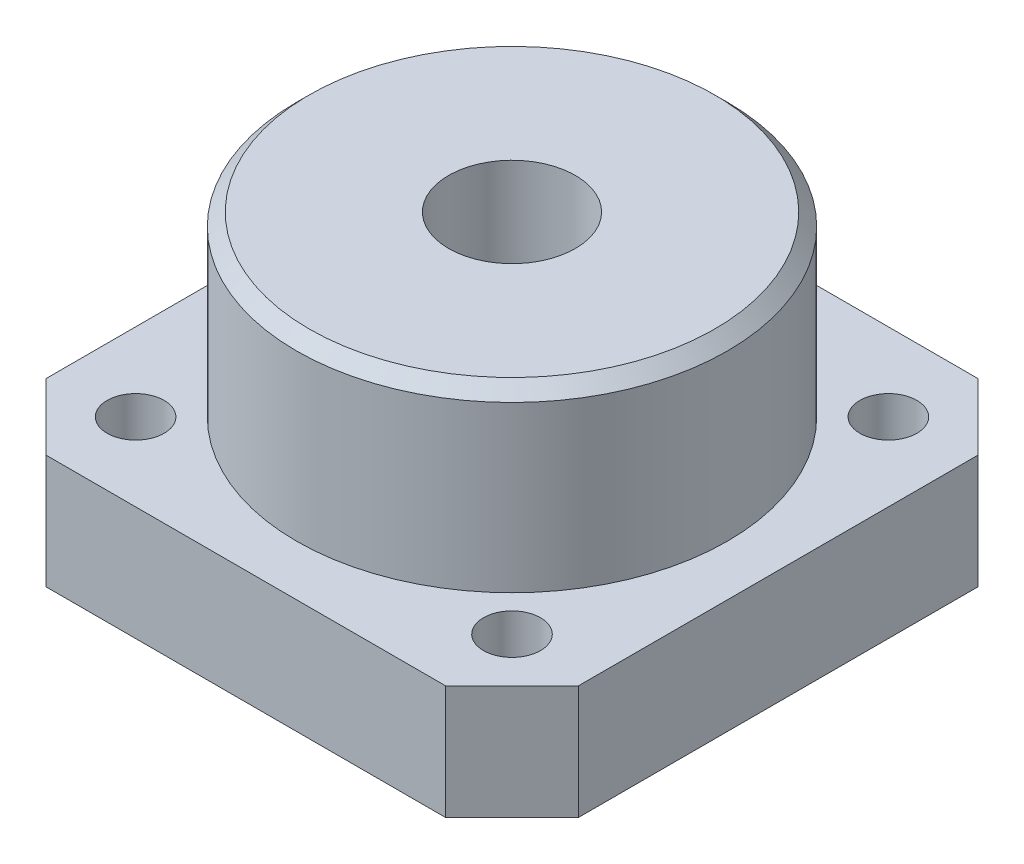
ISO-10303-21;
HEADER;
FILE_DESCRIPTION(('STEP AP214'),'2;1');
FILE_NAME('part.step','',(''),(''),'','','');
FILE_SCHEMA(('AUTOMOTIVE_DESIGN { 1 0 10303 214 1 1 1 1 }'));
ENDSEC;
DATA;
#1=APPLICATION_CONTEXT('core data for automotive mechanical design processes');
#2=APPLICATION_PROTOCOL_DEFINITION('international standard','automotive_design',2000,#1);
#3=PRODUCT_CONTEXT('',#1,'mechanical');
#4=PRODUCT('Part','Part','',(#3));
#5=PRODUCT_RELATED_PRODUCT_CATEGORY('part','',(#4));
#6=PRODUCT_DEFINITION_FORMATION('','',#4);
#7=PRODUCT_DEFINITION_CONTEXT('part definition',#1,'design');
#8=PRODUCT_DEFINITION('design','',#6,#7);
#9=PRODUCT_DEFINITION_SHAPE('','',#8);
#10=(LENGTH_UNIT() NAMED_UNIT(*) SI_UNIT(.MILLI.,.METRE.));
#11=(NAMED_UNIT(*) PLANE_ANGLE_UNIT() SI_UNIT($,.RADIAN.));
#12=(NAMED_UNIT(*) SI_UNIT($,.STERADIAN.) SOLID_ANGLE_UNIT());
#13=UNCERTAINTY_MEASURE_WITH_UNIT(LENGTH_MEASURE(1.E-05),#10,'distance_accuracy_value','');
#14=(GEOMETRIC_REPRESENTATION_CONTEXT(3) GLOBAL_UNCERTAINTY_ASSIGNED_CONTEXT((#13)) GLOBAL_UNIT_ASSIGNED_CONTEXT((#10,
#11,#12)) REPRESENTATION_CONTEXT('',''));
#15=CARTESIAN_POINT('',(0.,0.,0.));
#16=DIRECTION('',(0.,0.,1.));
#17=DIRECTION('',(1.,0.,0.));
#18=AXIS2_PLACEMENT_3D('',#15,#16,#17);
#19=CARTESIAN_POINT('',(0.,9.,0.));
#20=DIRECTION('',(0.,-1.,0.));
#21=DIRECTION('',(0.,0.,-1.));
#22=AXIS2_PLACEMENT_3D('',#19,#20,#21);
#23=PLANE('',#22);
#24=CARTESIAN_POINT('',(0.,9.,0.));
#25=DIRECTION('',(0.,1.,0.));
#26=DIRECTION('',(0.,0.,1.));
#27=AXIS2_PLACEMENT_3D('',#24,#25,#26);
#28=CIRCLE('',#27,17.);
#29=CARTESIAN_POINT('',(0.,9.,17.));
#30=VERTEX_POINT('',#29);
#31=EDGE_CURVE('E169',#30,#30,#28,.T.);
#32=ORIENTED_EDGE('',*,*,#31,.F.);
#33=EDGE_LOOP('',(#32));
#34=FACE_BOUND('',#33,.T.);
#35=DIRECTION('',(-1.,0.,0.));
#36=VECTOR('',#35,1.);
#37=CARTESIAN_POINT('',(-15.7695526217005,9.,-21.));
#38=LINE('',#37,#36);
#39=CARTESIAN_POINT('',(15.7695526217005,9.,-21.));
#40=VERTEX_POINT('',#39);
#41=CARTESIAN_POINT('',(-15.7695526217005,9.,-21.));
#42=VERTEX_POINT('',#41);
#43=EDGE_CURVE('E54',#40,#42,#38,.T.);
#44=ORIENTED_EDGE('',*,*,#43,.T.);
#45=DIRECTION('',(-0.707106781186546,0.,0.707106781186549));
#46=VECTOR('',#45,1.);
#47=CARTESIAN_POINT('',(-21.,9.,-15.7695526217005));
#48=LINE('',#47,#46);
#49=CARTESIAN_POINT('',(-21.,9.,-15.7695526217005));
#50=VERTEX_POINT('',#49);
#51=EDGE_CURVE('E98',#42,#50,#48,.T.);
#52=ORIENTED_EDGE('',*,*,#51,.T.);
#53=DIRECTION('',(0.,0.,1.));
#54=VECTOR('',#53,1.);
#55=CARTESIAN_POINT('',(-21.,9.,0.));
#56=LINE('',#55,#54);
#57=CARTESIAN_POINT('',(-21.,9.,15.7695526217005));
#58=VERTEX_POINT('',#57);
#59=EDGE_CURVE('E253',#50,#58,#56,.T.);
#60=ORIENTED_EDGE('',*,*,#59,.T.);
#61=DIRECTION('',(0.70710678118655,0.,0.707106781186545));
#62=VECTOR('',#61,1.);
#63=CARTESIAN_POINT('',(-15.7695526217005,9.,21.));
#64=LINE('',#63,#62);
#65=CARTESIAN_POINT('',(-15.7695526217005,9.,21.));
#66=VERTEX_POINT('',#65);
#67=EDGE_CURVE('E255',#58,#66,#64,.T.);
#68=ORIENTED_EDGE('',*,*,#67,.T.);
#69=DIRECTION('',(1.,0.,0.));
#70=VECTOR('',#69,1.);
#71=CARTESIAN_POINT('',(0.,9.,21.));
#72=LINE('',#71,#70);
#73=CARTESIAN_POINT('',(15.7695526217005,9.,21.));
#74=VERTEX_POINT('',#73);
#75=EDGE_CURVE('E118',#66,#74,#72,.T.);
#76=ORIENTED_EDGE('',*,*,#75,.T.);
#77=DIRECTION('',(0.707106781186546,0.,-0.707106781186549));
#78=VECTOR('',#77,1.);
#79=CARTESIAN_POINT('',(21.,9.,15.7695526217005));
#80=LINE('',#79,#78);
#81=CARTESIAN_POINT('',(21.,9.,15.7695526217005));
#82=VERTEX_POINT('',#81);
#83=EDGE_CURVE('E112',#74,#82,#80,.T.);
#84=ORIENTED_EDGE('',*,*,#83,.T.);
#85=DIRECTION('',(0.,0.,-1.));
#86=VECTOR('',#85,1.);
#87=CARTESIAN_POINT('',(21.,9.,0.));
#88=LINE('',#87,#86);
#89=CARTESIAN_POINT('',(21.,9.,-15.7695526217005));
#90=VERTEX_POINT('',#89);
#91=EDGE_CURVE('E116',#82,#90,#88,.T.);
#92=ORIENTED_EDGE('',*,*,#91,.T.);
#93=DIRECTION('',(-0.707106781186549,0.,-0.707106781186546));
#94=VECTOR('',#93,1.);
#95=CARTESIAN_POINT('',(15.7695526217005,9.,-21.));
#96=LINE('',#95,#94);
#97=EDGE_CURVE('E133',#90,#40,#96,.T.);
#98=ORIENTED_EDGE('',*,*,#97,.T.);
#99=EDGE_LOOP('',(#44,#52,#60,#68,#76,#84,#92,#98));
#100=FACE_BOUND('',#99,.T.);
#101=CARTESIAN_POINT('',(14.8492424049175,9.,-14.8492424049175));
#102=DIRECTION('',(0.,1.,0.));
#103=DIRECTION('',(0.,0.,1.));
#104=AXIS2_PLACEMENT_3D('',#101,#102,#103);
#105=CIRCLE('',#104,2.25);
#106=CARTESIAN_POINT('',(14.8492424049175,9.,-12.5992424049175));
#107=VERTEX_POINT('',#106);
#108=EDGE_CURVE('E143',#107,#107,#105,.T.);
#109=ORIENTED_EDGE('',*,*,#108,.F.);
#110=EDGE_LOOP('',(#109));
#111=FACE_BOUND('',#110,.T.);
#112=CARTESIAN_POINT('',(14.8492424049175,9.,14.8492424049175));
#113=DIRECTION('',(0.,1.,0.));
#114=DIRECTION('',(0.,0.,1.));
#115=AXIS2_PLACEMENT_3D('',#112,#113,#114);
#116=CIRCLE('',#115,2.25);
#117=CARTESIAN_POINT('',(14.8492424049175,9.,17.0992424049175));
#118=VERTEX_POINT('',#117);
#119=EDGE_CURVE('E263',#118,#118,#116,.T.);
#120=ORIENTED_EDGE('',*,*,#119,.F.);
#121=EDGE_LOOP('',(#120));
#122=FACE_BOUND('',#121,.T.);
#123=CARTESIAN_POINT('',(-14.8492424049175,9.,14.8492424049175));
#124=DIRECTION('',(0.,1.,0.));
#125=DIRECTION('',(0.,0.,1.));
#126=AXIS2_PLACEMENT_3D('',#123,#124,#125);
#127=CIRCLE('',#126,2.25);
#128=CARTESIAN_POINT('',(-14.8492424049175,9.,17.0992424049175));
#129=VERTEX_POINT('',#128);
#130=EDGE_CURVE('E266',#129,#129,#127,.T.);
#131=ORIENTED_EDGE('',*,*,#130,.F.);
#132=EDGE_LOOP('',(#131));
#133=FACE_BOUND('',#132,.T.);
#134=CARTESIAN_POINT('',(-14.8492424049175,9.,-14.8492424049175));
#135=DIRECTION('',(0.,1.,0.));
#136=DIRECTION('',(0.,0.,1.));
#137=AXIS2_PLACEMENT_3D('',#134,#135,#136);
#138=CIRCLE('',#137,2.25);
#139=CARTESIAN_POINT('',(-14.8492424049175,9.,-12.5992424049175));
#140=VERTEX_POINT('',#139);
#141=EDGE_CURVE('E183',#140,#140,#138,.T.);
#142=ORIENTED_EDGE('',*,*,#141,.F.);
#143=EDGE_LOOP('',(#142));
#144=FACE_BOUND('',#143,.T.);
#145=ADVANCED_FACE('F37',(#34,#100,#111,#122,#133,#144),#23,.F.);
#146=CARTESIAN_POINT('',(0.,0.,0.));
#147=DIRECTION('',(0.,-1.,0.));
#148=DIRECTION('',(0.,0.,-1.));
#149=AXIS2_PLACEMENT_3D('',#146,#147,#148);
#150=PLANE('',#149);
#151=CARTESIAN_POINT('',(0.,0.,0.));
#152=DIRECTION('',(0.,-1.,0.));
#153=DIRECTION('',(0.,0.,-1.));
#154=AXIS2_PLACEMENT_3D('',#151,#152,#153);
#155=CIRCLE('',#154,13.);
#156=CARTESIAN_POINT('',(0.,0.,-13.));
#157=VERTEX_POINT('',#156);
#158=EDGE_CURVE('E281',#157,#157,#155,.T.);
#159=ORIENTED_EDGE('',*,*,#158,.F.);
#160=EDGE_LOOP('',(#159));
#161=FACE_BOUND('',#160,.T.);
#162=CARTESIAN_POINT('',(-14.8492424049175,0.,14.8492424049175));
#163=DIRECTION('',(0.,1.,0.));
#164=DIRECTION('',(0.,0.,1.));
#165=AXIS2_PLACEMENT_3D('',#162,#163,#164);
#166=CIRCLE('',#165,4.);
#167=CARTESIAN_POINT('',(-14.8492424049175,0.,18.8492424049175));
#168=VERTEX_POINT('',#167);
#169=EDGE_CURVE('E277',#168,#168,#166,.T.);
#170=ORIENTED_EDGE('',*,*,#169,.T.);
#171=EDGE_LOOP('',(#170));
#172=FACE_BOUND('',#171,.T.);
#173=CARTESIAN_POINT('',(14.8492424049175,0.,14.8492424049175));
#174=DIRECTION('',(0.,1.,0.));
#175=DIRECTION('',(0.,0.,1.));
#176=AXIS2_PLACEMENT_3D('',#173,#174,#175);
#177=CIRCLE('',#176,4.);
#178=CARTESIAN_POINT('',(14.8492424049175,0.,18.8492424049175));
#179=VERTEX_POINT('',#178);
#180=EDGE_CURVE('E284',#179,#179,#177,.T.);
#181=ORIENTED_EDGE('',*,*,#180,.T.);
#182=EDGE_LOOP('',(#181));
#183=FACE_BOUND('',#182,.T.);
#184=CARTESIAN_POINT('',(14.8492424049175,0.,-14.8492424049175));
#185=DIRECTION('',(0.,1.,0.));
#186=DIRECTION('',(0.,0.,1.));
#187=AXIS2_PLACEMENT_3D('',#184,#185,#186);
#188=CIRCLE('',#187,4.);
#189=CARTESIAN_POINT('',(14.8492424049175,0.,-10.8492424049175));
#190=VERTEX_POINT('',#189);
#191=EDGE_CURVE('E290',#190,#190,#188,.T.);
#192=ORIENTED_EDGE('',*,*,#191,.T.);
#193=EDGE_LOOP('',(#192));
#194=FACE_BOUND('',#193,.T.);
#195=CARTESIAN_POINT('',(-14.8492424049175,0.,-14.8492424049175));
#196=DIRECTION('',(0.,1.,0.));
#197=DIRECTION('',(0.,0.,1.));
#198=AXIS2_PLACEMENT_3D('',#195,#196,#197);
#199=CIRCLE('',#198,4.);
#200=CARTESIAN_POINT('',(-14.8492424049175,0.,-10.8492424049175));
#201=VERTEX_POINT('',#200);
#202=EDGE_CURVE('E271',#201,#201,#199,.T.);
#203=ORIENTED_EDGE('',*,*,#202,.T.);
#204=EDGE_LOOP('',(#203));
#205=FACE_BOUND('',#204,.T.);
#206=DIRECTION('',(-0.707106781186546,0.,0.707106781186549));
#207=VECTOR('',#206,1.);
#208=CARTESIAN_POINT('',(-21.,0.,-15.7695526217005));
#209=LINE('',#208,#207);
#210=CARTESIAN_POINT('',(-15.7695526217005,0.,-21.));
#211=VERTEX_POINT('',#210);
#212=CARTESIAN_POINT('',(-21.,0.,-15.7695526217005));
#213=VERTEX_POINT('',#212);
#214=EDGE_CURVE('E139',#211,#213,#209,.T.);
#215=ORIENTED_EDGE('',*,*,#214,.F.);
#216=DIRECTION('',(-1.,0.,0.));
#217=VECTOR('',#216,1.);
#218=CARTESIAN_POINT('',(0.,0.,-21.));
#219=LINE('',#218,#217);
#220=CARTESIAN_POINT('',(15.7695526217005,0.,-21.));
#221=VERTEX_POINT('',#220);
#222=EDGE_CURVE('E153',#221,#211,#219,.T.);
#223=ORIENTED_EDGE('',*,*,#222,.F.);
#224=DIRECTION('',(-0.707106781186549,0.,-0.707106781186546));
#225=VECTOR('',#224,1.);
#226=CARTESIAN_POINT('',(15.7695526217005,0.,-21.));
#227=LINE('',#226,#225);
#228=CARTESIAN_POINT('',(21.,0.,-15.7695526217005));
#229=VERTEX_POINT('',#228);
#230=EDGE_CURVE('E90',#229,#221,#227,.T.);
#231=ORIENTED_EDGE('',*,*,#230,.F.);
#232=DIRECTION('',(0.,0.,-1.));
#233=VECTOR('',#232,1.);
#234=CARTESIAN_POINT('',(21.,0.,-15.7695526217005));
#235=LINE('',#234,#233);
#236=CARTESIAN_POINT('',(21.,0.,15.7695526217005));
#237=VERTEX_POINT('',#236);
#238=EDGE_CURVE('E83',#237,#229,#235,.T.);
#239=ORIENTED_EDGE('',*,*,#238,.F.);
#240=DIRECTION('',(0.707106781186546,0.,-0.707106781186549));
#241=VECTOR('',#240,1.);
#242=CARTESIAN_POINT('',(21.,0.,15.7695526217005));
#243=LINE('',#242,#241);
#244=CARTESIAN_POINT('',(15.7695526217005,0.,21.));
#245=VERTEX_POINT('',#244);
#246=EDGE_CURVE('E127',#245,#237,#243,.T.);
#247=ORIENTED_EDGE('',*,*,#246,.F.);
#248=DIRECTION('',(1.,0.,0.));
#249=VECTOR('',#248,1.);
#250=CARTESIAN_POINT('',(15.7695526217005,0.,21.));
#251=LINE('',#250,#249);
#252=CARTESIAN_POINT('',(-15.7695526217005,0.,21.));
#253=VERTEX_POINT('',#252);
#254=EDGE_CURVE('E148',#253,#245,#251,.T.);
#255=ORIENTED_EDGE('',*,*,#254,.F.);
#256=DIRECTION('',(0.70710678118655,0.,0.707106781186545));
#257=VECTOR('',#256,1.);
#258=CARTESIAN_POINT('',(-15.7695526217005,0.,21.));
#259=LINE('',#258,#257);
#260=CARTESIAN_POINT('',(-21.,0.,15.7695526217005));
#261=VERTEX_POINT('',#260);
#262=EDGE_CURVE('E145',#261,#253,#259,.T.);
#263=ORIENTED_EDGE('',*,*,#262,.F.);
#264=DIRECTION('',(0.,0.,1.));
#265=VECTOR('',#264,1.);
#266=CARTESIAN_POINT('',(-21.,0.,15.7695526217005));
#267=LINE('',#266,#265);
#268=EDGE_CURVE('E142',#213,#261,#267,.T.);
#269=ORIENTED_EDGE('',*,*,#268,.F.);
#270=EDGE_LOOP('',(#215,#223,#231,#239,#247,#255,#263,#269));
#271=FACE_BOUND('',#270,.T.);
#272=ADVANCED_FACE('F208',(#161,#172,#183,#194,#205,#271),#150,.T.);
#273=CARTESIAN_POINT('',(-21.,9.,-15.7695526217005));
#274=DIRECTION('',(0.707106781186549,0.,0.707106781186546));
#275=DIRECTION('',(0.707106781186546,0.,-0.707106781186549));
#276=AXIS2_PLACEMENT_3D('',#273,#274,#275);
#277=PLANE('',#276);
#278=ORIENTED_EDGE('',*,*,#214,.T.);
#279=DIRECTION('',(0.,-1.,0.));
#280=VECTOR('',#279,1.);
#281=CARTESIAN_POINT('',(-21.,9.,-15.7695526217005));
#282=LINE('',#281,#280);
#283=EDGE_CURVE('E164',#50,#213,#282,.T.);
#284=ORIENTED_EDGE('',*,*,#283,.F.);
#285=ORIENTED_EDGE('',*,*,#51,.F.);
#286=DIRECTION('',(0.,-1.,0.));
#287=VECTOR('',#286,1.);
#288=CARTESIAN_POINT('',(-15.7695526217005,9.,-21.));
#289=LINE('',#288,#287);
#290=EDGE_CURVE('E167',#42,#211,#289,.T.);
#291=ORIENTED_EDGE('',*,*,#290,.T.);
#292=EDGE_LOOP('',(#278,#284,#285,#291));
#293=FACE_BOUND('',#292,.T.);
#294=ADVANCED_FACE('F214',(#293),#277,.F.);
#295=CARTESIAN_POINT('',(-21.,9.,15.7695526217005));
#296=DIRECTION('',(1.,0.,0.));
#297=DIRECTION('',(0.,0.,-1.));
#298=AXIS2_PLACEMENT_3D('',#295,#296,#297);
#299=PLANE('',#298);
#300=ORIENTED_EDGE('',*,*,#268,.T.);
#301=DIRECTION('',(0.,-1.,0.));
#302=VECTOR('',#301,1.);
#303=CARTESIAN_POINT('',(-21.,9.,15.7695526217005));
#304=LINE('',#303,#302);
#305=EDGE_CURVE('E161',#58,#261,#304,.T.);
#306=ORIENTED_EDGE('',*,*,#305,.F.);
#307=ORIENTED_EDGE('',*,*,#59,.F.);
#308=ORIENTED_EDGE('',*,*,#283,.T.);
#309=EDGE_LOOP('',(#300,#306,#307,#308));
#310=FACE_BOUND('',#309,.T.);
#311=ADVANCED_FACE('F240',(#310),#299,.F.);
#312=CARTESIAN_POINT('',(-15.7695526217005,9.,21.));
#313=DIRECTION('',(0.707106781186545,0.,-0.70710678118655));
#314=DIRECTION('',(-0.70710678118655,0.,-0.707106781186545));
#315=AXIS2_PLACEMENT_3D('',#312,#313,#314);
#316=PLANE('',#315);
#317=ORIENTED_EDGE('',*,*,#262,.T.);
#318=DIRECTION('',(0.,-1.,0.));
#319=VECTOR('',#318,1.);
#320=CARTESIAN_POINT('',(-15.7695526217005,9.,21.));
#321=LINE('',#320,#319);
#322=EDGE_CURVE('E158',#66,#253,#321,.T.);
#323=ORIENTED_EDGE('',*,*,#322,.F.);
#324=ORIENTED_EDGE('',*,*,#67,.F.);
#325=ORIENTED_EDGE('',*,*,#305,.T.);
#326=EDGE_LOOP('',(#317,#323,#324,#325));
#327=FACE_BOUND('',#326,.T.);
#328=ADVANCED_FACE('F236',(#327),#316,.F.);
#329=CARTESIAN_POINT('',(15.7695526217005,9.,21.));
#330=DIRECTION('',(0.,0.,-1.));
#331=DIRECTION('',(-1.,0.,0.));
#332=AXIS2_PLACEMENT_3D('',#329,#330,#331);
#333=PLANE('',#332);
#334=ORIENTED_EDGE('',*,*,#254,.T.);
#335=DIRECTION('',(0.,-1.,0.));
#336=VECTOR('',#335,1.);
#337=CARTESIAN_POINT('',(15.7695526217005,9.,21.));
#338=LINE('',#337,#336);
#339=EDGE_CURVE('E128',#74,#245,#338,.T.);
#340=ORIENTED_EDGE('',*,*,#339,.F.);
#341=ORIENTED_EDGE('',*,*,#75,.F.);
#342=ORIENTED_EDGE('',*,*,#322,.T.);
#343=EDGE_LOOP('',(#334,#340,#341,#342));
#344=FACE_BOUND('',#343,.T.);
#345=ADVANCED_FACE('F233',(#344),#333,.F.);
#346=CARTESIAN_POINT('',(21.,9.,15.7695526217005));
#347=DIRECTION('',(-0.707106781186549,0.,-0.707106781186546));
#348=DIRECTION('',(-0.707106781186546,0.,0.707106781186549));
#349=AXIS2_PLACEMENT_3D('',#346,#347,#348);
#350=PLANE('',#349);
#351=ORIENTED_EDGE('',*,*,#246,.T.);
#352=DIRECTION('',(0.,-1.,0.));
#353=VECTOR('',#352,1.);
#354=CARTESIAN_POINT('',(21.,9.,15.7695526217005));
#355=LINE('',#354,#353);
#356=EDGE_CURVE('E124',#82,#237,#355,.T.);
#357=ORIENTED_EDGE('',*,*,#356,.F.);
#358=ORIENTED_EDGE('',*,*,#83,.F.);
#359=ORIENTED_EDGE('',*,*,#339,.T.);
#360=EDGE_LOOP('',(#351,#357,#358,#359));
#361=FACE_BOUND('',#360,.T.);
#362=ADVANCED_FACE('F125',(#361),#350,.F.);
#363=CARTESIAN_POINT('',(21.,9.,-15.7695526217005));
#364=DIRECTION('',(-1.,0.,0.));
#365=DIRECTION('',(0.,0.,1.));
#366=AXIS2_PLACEMENT_3D('',#363,#364,#365);
#367=PLANE('',#366);
#368=ORIENTED_EDGE('',*,*,#238,.T.);
#369=DIRECTION('',(0.,-1.,0.));
#370=VECTOR('',#369,1.);
#371=CARTESIAN_POINT('',(21.,9.,-15.7695526217005));
#372=LINE('',#371,#370);
#373=EDGE_CURVE('E129',#90,#229,#372,.T.);
#374=ORIENTED_EDGE('',*,*,#373,.F.);
#375=ORIENTED_EDGE('',*,*,#91,.F.);
#376=ORIENTED_EDGE('',*,*,#356,.T.);
#377=EDGE_LOOP('',(#368,#374,#375,#376));
#378=FACE_BOUND('',#377,.T.);
#379=ADVANCED_FACE('F131',(#378),#367,.F.);
#380=CARTESIAN_POINT('',(15.7695526217005,9.,-21.));
#381=DIRECTION('',(-0.707106781186546,0.,0.707106781186549));
#382=DIRECTION('',(0.707106781186549,0.,0.707106781186546));
#383=AXIS2_PLACEMENT_3D('',#380,#381,#382);
#384=PLANE('',#383);
#385=ORIENTED_EDGE('',*,*,#230,.T.);
#386=DIRECTION('',(0.,-1.,0.));
#387=VECTOR('',#386,1.);
#388=CARTESIAN_POINT('',(15.7695526217005,9.,-21.));
#389=LINE('',#388,#387);
#390=EDGE_CURVE('E135',#40,#221,#389,.T.);
#391=ORIENTED_EDGE('',*,*,#390,.F.);
#392=ORIENTED_EDGE('',*,*,#97,.F.);
#393=ORIENTED_EDGE('',*,*,#373,.T.);
#394=EDGE_LOOP('',(#385,#391,#392,#393));
#395=FACE_BOUND('',#394,.T.);
#396=ADVANCED_FACE('F226',(#395),#384,.F.);
#397=CARTESIAN_POINT('',(0.,9.,-21.));
#398=DIRECTION('',(0.,0.,1.));
#399=DIRECTION('',(1.,0.,0.));
#400=AXIS2_PLACEMENT_3D('',#397,#398,#399);
#401=PLANE('',#400);
#402=ORIENTED_EDGE('',*,*,#222,.T.);
#403=ORIENTED_EDGE('',*,*,#290,.F.);
#404=ORIENTED_EDGE('',*,*,#43,.F.);
#405=ORIENTED_EDGE('',*,*,#390,.T.);
#406=EDGE_LOOP('',(#402,#403,#404,#405));
#407=FACE_BOUND('',#406,.T.);
#408=ADVANCED_FACE('F223',(#407),#401,.F.);
#409=CARTESIAN_POINT('',(14.8492424049175,9.,-14.8492424049175));
#410=DIRECTION('',(0.,-1.,0.));
#411=DIRECTION('',(0.,0.,-1.));
#412=AXIS2_PLACEMENT_3D('',#409,#410,#411);
#413=CYLINDRICAL_SURFACE('',#412,2.25);
#414=CARTESIAN_POINT('',(14.8492424049175,4.,-14.8492424049175));
#415=DIRECTION('',(0.,1.,0.));
#416=DIRECTION('',(0.,0.,1.));
#417=AXIS2_PLACEMENT_3D('',#414,#415,#416);
#418=CIRCLE('',#417,2.25);
#419=CARTESIAN_POINT('',(14.8492424049175,4.,-12.5992424049175));
#420=VERTEX_POINT('',#419);
#421=EDGE_CURVE('E180',#420,#420,#418,.T.);
#422=ORIENTED_EDGE('',*,*,#421,.F.);
#423=EDGE_LOOP('',(#422));
#424=FACE_BOUND('',#423,.T.);
#425=ORIENTED_EDGE('',*,*,#108,.T.);
#426=EDGE_LOOP('',(#425));
#427=FACE_BOUND('',#426,.T.);
#428=ADVANCED_FACE('F220',(#424,#427),#413,.F.);
#429=CARTESIAN_POINT('',(14.8492424049175,9.,14.8492424049175));
#430=DIRECTION('',(0.,-1.,0.));
#431=DIRECTION('',(0.,0.,-1.));
#432=AXIS2_PLACEMENT_3D('',#429,#430,#431);
#433=CYLINDRICAL_SURFACE('',#432,2.25);
#434=CARTESIAN_POINT('',(14.8492424049175,4.,14.8492424049175));
#435=DIRECTION('',(0.,1.,0.));
#436=DIRECTION('',(0.,0.,1.));
#437=AXIS2_PLACEMENT_3D('',#434,#435,#436);
#438=CIRCLE('',#437,2.25);
#439=CARTESIAN_POINT('',(14.8492424049175,4.,17.0992424049175));
#440=VERTEX_POINT('',#439);
#441=EDGE_CURVE('E177',#440,#440,#438,.T.);
#442=ORIENTED_EDGE('',*,*,#441,.F.);
#443=EDGE_LOOP('',(#442));
#444=FACE_BOUND('',#443,.T.);
#445=ORIENTED_EDGE('',*,*,#119,.T.);
#446=EDGE_LOOP('',(#445));
#447=FACE_BOUND('',#446,.T.);
#448=ADVANCED_FACE('F362',(#444,#447),#433,.F.);
#449=CARTESIAN_POINT('',(-14.8492424049175,9.,14.8492424049175));
#450=DIRECTION('',(0.,-1.,0.));
#451=DIRECTION('',(0.,0.,-1.));
#452=AXIS2_PLACEMENT_3D('',#449,#450,#451);
#453=CYLINDRICAL_SURFACE('',#452,2.25);
#454=CARTESIAN_POINT('',(-14.8492424049175,4.,14.8492424049175));
#455=DIRECTION('',(0.,1.,0.));
#456=DIRECTION('',(0.,0.,1.));
#457=AXIS2_PLACEMENT_3D('',#454,#455,#456);
#458=CIRCLE('',#457,2.25);
#459=CARTESIAN_POINT('',(-14.8492424049175,4.,17.0992424049175));
#460=VERTEX_POINT('',#459);
#461=EDGE_CURVE('E173',#460,#460,#458,.T.);
#462=ORIENTED_EDGE('',*,*,#461,.F.);
#463=EDGE_LOOP('',(#462));
#464=FACE_BOUND('',#463,.T.);
#465=ORIENTED_EDGE('',*,*,#130,.T.);
#466=EDGE_LOOP('',(#465));
#467=FACE_BOUND('',#466,.T.);
#468=ADVANCED_FACE('F359',(#464,#467),#453,.F.);
#469=CARTESIAN_POINT('',(-14.8492424049175,9.,-14.8492424049175));
#470=DIRECTION('',(0.,-1.,0.));
#471=DIRECTION('',(0.,0.,-1.));
#472=AXIS2_PLACEMENT_3D('',#469,#470,#471);
#473=CYLINDRICAL_SURFACE('',#472,2.25);
#474=CARTESIAN_POINT('',(-14.8492424049175,4.,-14.8492424049175));
#475=DIRECTION('',(0.,1.,0.));
#476=DIRECTION('',(0.,0.,1.));
#477=AXIS2_PLACEMENT_3D('',#474,#475,#476);
#478=CIRCLE('',#477,2.25);
#479=CARTESIAN_POINT('',(-14.8492424049175,4.,-12.5992424049175));
#480=VERTEX_POINT('',#479);
#481=EDGE_CURVE('E170',#480,#480,#478,.T.);
#482=ORIENTED_EDGE('',*,*,#481,.F.);
#483=EDGE_LOOP('',(#482));
#484=FACE_BOUND('',#483,.T.);
#485=ORIENTED_EDGE('',*,*,#141,.T.);
#486=EDGE_LOOP('',(#485));
#487=FACE_BOUND('',#486,.T.);
#488=ADVANCED_FACE('F355',(#484,#487),#473,.F.);
#489=CARTESIAN_POINT('',(-14.8492424049175,4.,-14.8492424049175));
#490=DIRECTION('',(0.,-1.,0.));
#491=DIRECTION('',(0.,0.,-1.));
#492=AXIS2_PLACEMENT_3D('',#489,#490,#491);
#493=CYLINDRICAL_SURFACE('',#492,4.);
#494=CARTESIAN_POINT('',(-14.8492424049175,4.,-14.8492424049175));
#495=DIRECTION('',(0.,1.,0.));
#496=DIRECTION('',(0.,0.,1.));
#497=AXIS2_PLACEMENT_3D('',#494,#495,#496);
#498=CIRCLE('',#497,4.);
#499=CARTESIAN_POINT('',(-14.8492424049175,4.,-10.8492424049175));
#500=VERTEX_POINT('',#499);
#501=EDGE_CURVE('E174',#500,#500,#498,.T.);
#502=ORIENTED_EDGE('',*,*,#501,.T.);
#503=EDGE_LOOP('',(#502));
#504=FACE_BOUND('',#503,.T.);
#505=ORIENTED_EDGE('',*,*,#202,.F.);
#506=EDGE_LOOP('',(#505));
#507=FACE_BOUND('',#506,.T.);
#508=ADVANCED_FACE('F351',(#504,#507),#493,.F.);
#509=CARTESIAN_POINT('',(-14.8492424049175,4.,-14.8492424049175));
#510=DIRECTION('',(0.,1.,0.));
#511=DIRECTION('',(0.,0.,1.));
#512=AXIS2_PLACEMENT_3D('',#509,#510,#511);
#513=PLANE('',#512);
#514=ORIENTED_EDGE('',*,*,#481,.T.);
#515=EDGE_LOOP('',(#514));
#516=FACE_BOUND('',#515,.T.);
#517=ORIENTED_EDGE('',*,*,#501,.F.);
#518=EDGE_LOOP('',(#517));
#519=FACE_BOUND('',#518,.T.);
#520=ADVANCED_FACE('F347',(#516,#519),#513,.F.);
#521=CARTESIAN_POINT('',(-14.8492424049175,4.,14.8492424049175));
#522=DIRECTION('',(0.,-1.,0.));
#523=DIRECTION('',(0.,0.,-1.));
#524=AXIS2_PLACEMENT_3D('',#521,#522,#523);
#525=CYLINDRICAL_SURFACE('',#524,4.);
#526=CARTESIAN_POINT('',(-14.8492424049175,4.,14.8492424049175));
#527=DIRECTION('',(0.,1.,0.));
#528=DIRECTION('',(0.,0.,1.));
#529=AXIS2_PLACEMENT_3D('',#526,#527,#528);
#530=CIRCLE('',#529,4.);
#531=CARTESIAN_POINT('',(-14.8492424049175,4.,18.8492424049175));
#532=VERTEX_POINT('',#531);
#533=EDGE_CURVE('E280',#532,#532,#530,.T.);
#534=ORIENTED_EDGE('',*,*,#533,.T.);
#535=EDGE_LOOP('',(#534));
#536=FACE_BOUND('',#535,.T.);
#537=ORIENTED_EDGE('',*,*,#169,.F.);
#538=EDGE_LOOP('',(#537));
#539=FACE_BOUND('',#538,.T.);
#540=ADVANCED_FACE('F343',(#536,#539),#525,.F.);
#541=CARTESIAN_POINT('',(-14.8492424049175,4.,14.8492424049175));
#542=DIRECTION('',(0.,1.,0.));
#543=DIRECTION('',(0.,0.,1.));
#544=AXIS2_PLACEMENT_3D('',#541,#542,#543);
#545=PLANE('',#544);
#546=ORIENTED_EDGE('',*,*,#461,.T.);
#547=EDGE_LOOP('',(#546));
#548=FACE_BOUND('',#547,.T.);
#549=ORIENTED_EDGE('',*,*,#533,.F.);
#550=EDGE_LOOP('',(#549));
#551=FACE_BOUND('',#550,.T.);
#552=ADVANCED_FACE('F339',(#548,#551),#545,.F.);
#553=CARTESIAN_POINT('',(14.8492424049175,4.,14.8492424049175));
#554=DIRECTION('',(0.,-1.,0.));
#555=DIRECTION('',(0.,0.,-1.));
#556=AXIS2_PLACEMENT_3D('',#553,#554,#555);
#557=CYLINDRICAL_SURFACE('',#556,4.);
#558=CARTESIAN_POINT('',(14.8492424049175,4.,14.8492424049175));
#559=DIRECTION('',(0.,1.,0.));
#560=DIRECTION('',(0.,0.,1.));
#561=AXIS2_PLACEMENT_3D('',#558,#559,#560);
#562=CIRCLE('',#561,4.);
#563=CARTESIAN_POINT('',(14.8492424049175,4.,18.8492424049175));
#564=VERTEX_POINT('',#563);
#565=EDGE_CURVE('E287',#564,#564,#562,.T.);
#566=ORIENTED_EDGE('',*,*,#565,.T.);
#567=EDGE_LOOP('',(#566));
#568=FACE_BOUND('',#567,.T.);
#569=ORIENTED_EDGE('',*,*,#180,.F.);
#570=EDGE_LOOP('',(#569));
#571=FACE_BOUND('',#570,.T.);
#572=ADVANCED_FACE('F335',(#568,#571),#557,.F.);
#573=CARTESIAN_POINT('',(14.8492424049175,4.,14.8492424049175));
#574=DIRECTION('',(0.,1.,0.));
#575=DIRECTION('',(0.,0.,1.));
#576=AXIS2_PLACEMENT_3D('',#573,#574,#575);
#577=PLANE('',#576);
#578=ORIENTED_EDGE('',*,*,#441,.T.);
#579=EDGE_LOOP('',(#578));
#580=FACE_BOUND('',#579,.T.);
#581=ORIENTED_EDGE('',*,*,#565,.F.);
#582=EDGE_LOOP('',(#581));
#583=FACE_BOUND('',#582,.T.);
#584=ADVANCED_FACE('F331',(#580,#583),#577,.F.);
#585=CARTESIAN_POINT('',(14.8492424049175,4.,-14.8492424049175));
#586=DIRECTION('',(0.,-1.,0.));
#587=DIRECTION('',(0.,0.,-1.));
#588=AXIS2_PLACEMENT_3D('',#585,#586,#587);
#589=CYLINDRICAL_SURFACE('',#588,4.);
#590=CARTESIAN_POINT('',(14.8492424049175,4.,-14.8492424049175));
#591=DIRECTION('',(0.,1.,0.));
#592=DIRECTION('',(0.,0.,1.));
#593=AXIS2_PLACEMENT_3D('',#590,#591,#592);
#594=CIRCLE('',#593,4.);
#595=CARTESIAN_POINT('',(14.8492424049175,4.,-10.8492424049175));
#596=VERTEX_POINT('',#595);
#597=EDGE_CURVE('E274',#596,#596,#594,.T.);
#598=ORIENTED_EDGE('',*,*,#597,.T.);
#599=EDGE_LOOP('',(#598));
#600=FACE_BOUND('',#599,.T.);
#601=ORIENTED_EDGE('',*,*,#191,.F.);
#602=EDGE_LOOP('',(#601));
#603=FACE_BOUND('',#602,.T.);
#604=ADVANCED_FACE('F327',(#600,#603),#589,.F.);
#605=CARTESIAN_POINT('',(14.8492424049175,4.,-14.8492424049175));
#606=DIRECTION('',(0.,1.,0.));
#607=DIRECTION('',(0.,0.,1.));
#608=AXIS2_PLACEMENT_3D('',#605,#606,#607);
#609=PLANE('',#608);
#610=ORIENTED_EDGE('',*,*,#421,.T.);
#611=EDGE_LOOP('',(#610));
#612=FACE_BOUND('',#611,.T.);
#613=ORIENTED_EDGE('',*,*,#597,.F.);
#614=EDGE_LOOP('',(#613));
#615=FACE_BOUND('',#614,.T.);
#616=ADVANCED_FACE('F320',(#612,#615),#609,.F.);
#617=CARTESIAN_POINT('',(0.,23.,0.));
#618=DIRECTION('',(0.,-1.,0.));
#619=DIRECTION('',(0.,0.,-1.));
#620=AXIS2_PLACEMENT_3D('',#617,#618,#619);
#621=CYLINDRICAL_SURFACE('',#620,17.);
#622=CARTESIAN_POINT('',(0.,22.,0.));
#623=DIRECTION('',(0.,1.,0.));
#624=DIRECTION('',(0.,0.,1.));
#625=AXIS2_PLACEMENT_3D('',#622,#623,#624);
#626=CIRCLE('',#625,17.);
#627=CARTESIAN_POINT('',(0.,22.,17.));
#628=VERTEX_POINT('',#627);
#629=EDGE_CURVE('E11',#628,#628,#626,.F.);
#630=ORIENTED_EDGE('',*,*,#629,.T.);
#631=EDGE_LOOP('',(#630));
#632=FACE_BOUND('',#631,.T.);
#633=ORIENTED_EDGE('',*,*,#31,.T.);
#634=EDGE_LOOP('',(#633));
#635=FACE_BOUND('',#634,.T.);
#636=ADVANCED_FACE('F311',(#632,#635),#621,.T.);
#637=CARTESIAN_POINT('',(0.,23.,0.));
#638=DIRECTION('',(0.,1.,0.));
#639=DIRECTION('',(0.,0.,1.));
#640=AXIS2_PLACEMENT_3D('',#637,#638,#639);
#641=PLANE('',#640);
#642=CARTESIAN_POINT('',(0.,23.,0.));
#643=DIRECTION('',(0.,1.,0.));
#644=DIRECTION('',(0.,0.,1.));
#645=AXIS2_PLACEMENT_3D('',#642,#643,#644);
#646=CIRCLE('',#645,16.);
#647=CARTESIAN_POINT('',(0.,23.,16.));
#648=VERTEX_POINT('',#647);
#649=EDGE_CURVE('E46',#648,#648,#646,.T.);
#650=ORIENTED_EDGE('',*,*,#649,.T.);
#651=EDGE_LOOP('',(#650));
#652=FACE_BOUND('',#651,.T.);
#653=CARTESIAN_POINT('',(0.,23.,0.));
#654=DIRECTION('',(0.,1.,0.));
#655=DIRECTION('',(0.,0.,1.));
#656=AXIS2_PLACEMENT_3D('',#653,#654,#655);
#657=CIRCLE('',#656,5.);
#658=CARTESIAN_POINT('',(0.,23.,5.));
#659=VERTEX_POINT('',#658);
#660=EDGE_CURVE('E302',#659,#659,#657,.T.);
#661=ORIENTED_EDGE('',*,*,#660,.F.);
#662=EDGE_LOOP('',(#661));
#663=FACE_BOUND('',#662,.T.);
#664=ADVANCED_FACE('F195',(#652,#663),#641,.T.);
#665=CARTESIAN_POINT('',(0.,-7.5,0.));
#666=DIRECTION('',(0.,-1.,0.));
#667=DIRECTION('',(0.,0.,-1.));
#668=AXIS2_PLACEMENT_3D('',#665,#666,#667);
#669=PLANE('',#668);
#670=CARTESIAN_POINT('',(0.,-7.5,0.));
#671=DIRECTION('',(0.,-1.,0.));
#672=DIRECTION('',(0.,0.,-1.));
#673=AXIS2_PLACEMENT_3D('',#670,#671,#672);
#674=CIRCLE('',#673,12.);
#675=CARTESIAN_POINT('',(0.,-7.5,-12.));
#676=VERTEX_POINT('',#675);
#677=EDGE_CURVE('E187',#676,#676,#674,.T.);
#678=ORIENTED_EDGE('',*,*,#677,.T.);
#679=EDGE_LOOP('',(#678));
#680=FACE_BOUND('',#679,.T.);
#681=CARTESIAN_POINT('',(0.,-7.5,0.));
#682=DIRECTION('',(0.,-1.,0.));
#683=DIRECTION('',(0.,0.,-1.));
#684=AXIS2_PLACEMENT_3D('',#681,#682,#683);
#685=CIRCLE('',#684,11.);
#686=CARTESIAN_POINT('',(0.,-7.5,-11.));
#687=VERTEX_POINT('',#686);
#688=EDGE_CURVE('E299',#687,#687,#685,.T.);
#689=ORIENTED_EDGE('',*,*,#688,.F.);
#690=EDGE_LOOP('',(#689));
#691=FACE_BOUND('',#690,.T.);
#692=ADVANCED_FACE('F310',(#680,#691),#669,.T.);
#693=CARTESIAN_POINT('',(0.,-7.5,0.));
#694=DIRECTION('',(0.,1.,0.));
#695=DIRECTION('',(0.,0.,1.));
#696=AXIS2_PLACEMENT_3D('',#693,#694,#695);
#697=CYLINDRICAL_SURFACE('',#696,13.);
#698=CARTESIAN_POINT('',(0.,-6.49999999999999,0.));
#699=DIRECTION('',(0.,-1.,0.));
#700=DIRECTION('',(0.,0.,-1.));
#701=AXIS2_PLACEMENT_3D('',#698,#699,#700);
#702=CIRCLE('',#701,13.);
#703=CARTESIAN_POINT('',(0.,-6.49999999999999,-13.));
#704=VERTEX_POINT('',#703);
#705=EDGE_CURVE('E190',#704,#704,#702,.F.);
#706=ORIENTED_EDGE('',*,*,#705,.T.);
#707=EDGE_LOOP('',(#706));
#708=FACE_BOUND('',#707,.T.);
#709=ORIENTED_EDGE('',*,*,#158,.T.);
#710=EDGE_LOOP('',(#709));
#711=FACE_BOUND('',#710,.T.);
#712=ADVANCED_FACE('F317',(#708,#711),#697,.T.);
#713=CARTESIAN_POINT('',(0.,-7.5,0.));
#714=DIRECTION('',(0.,1.,0.));
#715=DIRECTION('',(0.,0.,1.));
#716=AXIS2_PLACEMENT_3D('',#713,#714,#715);
#717=CYLINDRICAL_SURFACE('',#716,11.);
#718=ORIENTED_EDGE('',*,*,#688,.T.);
#719=EDGE_LOOP('',(#718));
#720=FACE_BOUND('',#719,.T.);
#721=CARTESIAN_POINT('',(0.,0.,0.));
#722=DIRECTION('',(0.,-1.,0.));
#723=DIRECTION('',(0.,0.,-1.));
#724=AXIS2_PLACEMENT_3D('',#721,#722,#723);
#725=CIRCLE('',#724,11.);
#726=CARTESIAN_POINT('',(0.,0.,-11.));
#727=VERTEX_POINT('',#726);
#728=EDGE_CURVE('E184',#727,#727,#725,.F.);
#729=ORIENTED_EDGE('',*,*,#728,.T.);
#730=EDGE_LOOP('',(#729));
#731=FACE_BOUND('',#730,.T.);
#732=ADVANCED_FACE('F561',(#720,#731),#717,.F.);
#733=CARTESIAN_POINT('',(0.,0.,0.));
#734=DIRECTION('',(0.,-1.,0.));
#735=DIRECTION('',(0.,0.,-1.));
#736=AXIS2_PLACEMENT_3D('',#733,#734,#735);
#737=CIRCLE('',#736,5.);
#738=CARTESIAN_POINT('',(0.,0.,-5.));
#739=VERTEX_POINT('',#738);
#740=EDGE_CURVE('E303',#739,#739,#737,.F.);
#741=ORIENTED_EDGE('',*,*,#740,.T.);
#742=EDGE_LOOP('',(#741));
#743=FACE_BOUND('',#742,.T.);
#744=ORIENTED_EDGE('',*,*,#728,.F.);
#745=EDGE_LOOP('',(#744));
#746=FACE_BOUND('',#745,.T.);
#747=ADVANCED_FACE('F217',(#743,#746),#150,.T.);
#748=CARTESIAN_POINT('',(0.,-7.501,0.));
#749=DIRECTION('',(0.,1.,0.));
#750=DIRECTION('',(0.,0.,1.));
#751=AXIS2_PLACEMENT_3D('',#748,#749,#750);
#752=CYLINDRICAL_SURFACE('',#751,5.);
#753=ORIENTED_EDGE('',*,*,#740,.F.);
#754=EDGE_LOOP('',(#753));
#755=FACE_BOUND('',#754,.T.);
#756=ORIENTED_EDGE('',*,*,#660,.T.);
#757=EDGE_LOOP('',(#756));
#758=FACE_BOUND('',#757,.T.);
#759=ADVANCED_FACE('F204',(#755,#758),#752,.F.);
#760=CARTESIAN_POINT('',(0.,-7.5,0.));
#761=DIRECTION('',(0.,1.,0.));
#762=DIRECTION('',(0.,0.,1.));
#763=AXIS2_PLACEMENT_3D('',#760,#761,#762);
#764=CONICAL_SURFACE('',#763,12.,0.785398163397447);
#765=ORIENTED_EDGE('',*,*,#705,.F.);
#766=EDGE_LOOP('',(#765));
#767=FACE_BOUND('',#766,.T.);
#768=ORIENTED_EDGE('',*,*,#677,.F.);
#769=EDGE_LOOP('',(#768));
#770=FACE_BOUND('',#769,.T.);
#771=ADVANCED_FACE('F199',(#767,#770),#764,.T.);
#772=CARTESIAN_POINT('',(0.,23.,0.));
#773=DIRECTION('',(0.,-1.,0.));
#774=DIRECTION('',(0.,0.,-1.));
#775=AXIS2_PLACEMENT_3D('',#772,#773,#774);
#776=CONICAL_SURFACE('',#775,16.,0.785398163397447);
#777=ORIENTED_EDGE('',*,*,#629,.F.);
#778=EDGE_LOOP('',(#777));
#779=FACE_BOUND('',#778,.T.);
#780=ORIENTED_EDGE('',*,*,#649,.F.);
#781=EDGE_LOOP('',(#780));
#782=FACE_BOUND('',#781,.T.);
#783=ADVANCED_FACE('F39',(#779,#782),#776,.T.);
#784=CLOSED_SHELL('',(#145,#272,#294,#311,#328,#345,#362,#379,#396,#408,#428,#448,#468,#488,
#508,#520,#540,#552,#572,#584,#604,#616,#636,#664,#692,#712,#732,#747,#759,#771,#783));
#785=MANIFOLD_SOLID_BREP('B2',#784);
#786=ADVANCED_BREP_SHAPE_REPRESENTATION('',(#18,#785),#14);
#787=SHAPE_DEFINITION_REPRESENTATION(#9,#786);
ENDSEC;
END-ISO-10303-21;
